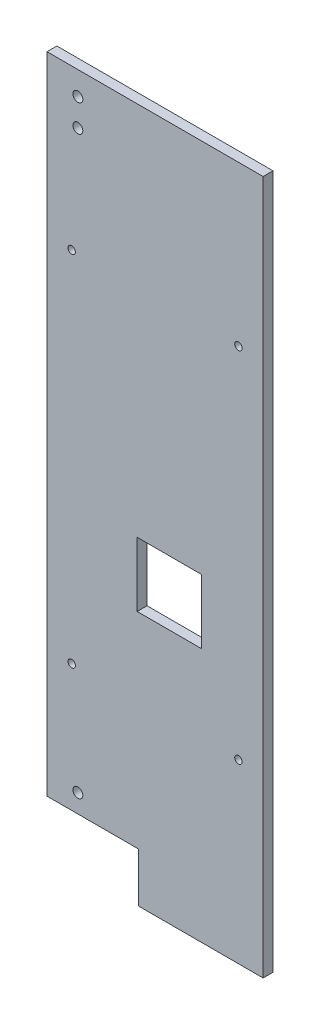
ISO-10303-21;
HEADER;
FILE_DESCRIPTION(('STEP AP214'),'2;1');
FILE_NAME('part.step','',(''),(''),'','','');
FILE_SCHEMA(('AUTOMOTIVE_DESIGN { 1 0 10303 214 1 1 1 1 }'));
ENDSEC;
DATA;
#1=APPLICATION_CONTEXT('core data for automotive mechanical design processes');
#2=APPLICATION_PROTOCOL_DEFINITION('international standard','automotive_design',2000,#1);
#3=PRODUCT_CONTEXT('',#1,'mechanical');
#4=PRODUCT('Part','Part','',(#3));
#5=PRODUCT_RELATED_PRODUCT_CATEGORY('part','',(#4));
#6=PRODUCT_DEFINITION_FORMATION('','',#4);
#7=PRODUCT_DEFINITION_CONTEXT('part definition',#1,'design');
#8=PRODUCT_DEFINITION('design','',#6,#7);
#9=PRODUCT_DEFINITION_SHAPE('','',#8);
#10=(LENGTH_UNIT() NAMED_UNIT(*) SI_UNIT(.MILLI.,.METRE.));
#11=(NAMED_UNIT(*) PLANE_ANGLE_UNIT() SI_UNIT($,.RADIAN.));
#12=(NAMED_UNIT(*) SI_UNIT($,.STERADIAN.) SOLID_ANGLE_UNIT());
#13=UNCERTAINTY_MEASURE_WITH_UNIT(LENGTH_MEASURE(1.E-05),#10,'distance_accuracy_value','');
#14=(GEOMETRIC_REPRESENTATION_CONTEXT(3) GLOBAL_UNCERTAINTY_ASSIGNED_CONTEXT((#13)) GLOBAL_UNIT_ASSIGNED_CONTEXT((#10,
#11,#12)) REPRESENTATION_CONTEXT('',''));
#15=CARTESIAN_POINT('',(0.,0.,0.));
#16=DIRECTION('',(0.,0.,1.));
#17=DIRECTION('',(1.,0.,0.));
#18=AXIS2_PLACEMENT_3D('',#15,#16,#17);
#19=CARTESIAN_POINT('',(-30.5376862476674,-226.819578947368,4.));
#20=DIRECTION('',(0.,0.,1.));
#21=DIRECTION('',(1.,0.,0.));
#22=AXIS2_PLACEMENT_3D('',#19,#20,#21);
#23=PLANE('',#22);
#24=CARTESIAN_POINT('',(-18.0376862476674,24.6804210526316,4.));
#25=DIRECTION('',(0.,0.,1.));
#26=DIRECTION('',(1.,0.,0.));
#27=AXIS2_PLACEMENT_3D('',#24,#25,#26);
#28=CIRCLE('',#27,2.);
#29=CARTESIAN_POINT('',(-16.0376862476674,24.6804210526316,4.));
#30=VERTEX_POINT('',#29);
#31=EDGE_CURVE('E284',#30,#30,#28,.T.);
#32=ORIENTED_EDGE('',*,*,#31,.F.);
#33=EDGE_LOOP('',(#32));
#34=FACE_BOUND('',#33,.T.);
#35=CARTESIAN_POINT('',(46.9623137523326,-175.319578947368,4.));
#36=DIRECTION('',(0.,0.,1.));
#37=DIRECTION('',(1.,0.,0.));
#38=AXIS2_PLACEMENT_3D('',#35,#36,#37);
#39=CIRCLE('',#38,1.5);
#40=CARTESIAN_POINT('',(48.4623137523326,-175.319578947368,4.));
#41=VERTEX_POINT('',#40);
#42=EDGE_CURVE('E296',#41,#41,#39,.T.);
#43=ORIENTED_EDGE('',*,*,#42,.F.);
#44=EDGE_LOOP('',(#43));
#45=FACE_BOUND('',#44,.T.);
#46=CARTESIAN_POINT('',(-20.5376862476674,-30.3195789473684,4.));
#47=DIRECTION('',(0.,0.,1.));
#48=DIRECTION('',(1.,0.,0.));
#49=AXIS2_PLACEMENT_3D('',#46,#47,#48);
#50=CIRCLE('',#49,1.5);
#51=CARTESIAN_POINT('',(-19.0376862476674,-30.3195789473684,4.));
#52=VERTEX_POINT('',#51);
#53=EDGE_CURVE('E308',#52,#52,#50,.T.);
#54=ORIENTED_EDGE('',*,*,#53,.F.);
#55=EDGE_LOOP('',(#54));
#56=FACE_BOUND('',#55,.T.);
#57=DIRECTION('',(1.,0.,0.));
#58=VECTOR('',#57,1.);
#59=CARTESIAN_POINT('',(5.96231375233261,-143.819578947368,4.));
#60=LINE('',#59,#58);
#61=CARTESIAN_POINT('',(5.96231375233261,-143.819578947368,4.));
#62=VERTEX_POINT('',#61);
#63=CARTESIAN_POINT('',(31.9623137523326,-143.819578947368,4.));
#64=VERTEX_POINT('',#63);
#65=EDGE_CURVE('E116',#62,#64,#60,.T.);
#66=ORIENTED_EDGE('',*,*,#65,.F.);
#67=DIRECTION('',(0.,-1.,0.));
#68=VECTOR('',#67,1.);
#69=CARTESIAN_POINT('',(5.9623137523326,-117.819578947368,4.));
#70=LINE('',#69,#68);
#71=CARTESIAN_POINT('',(5.9623137523326,-117.819578947368,4.));
#72=VERTEX_POINT('',#71);
#73=EDGE_CURVE('E108',#72,#62,#70,.T.);
#74=ORIENTED_EDGE('',*,*,#73,.F.);
#75=DIRECTION('',(-1.,0.,0.));
#76=VECTOR('',#75,1.);
#77=CARTESIAN_POINT('',(5.9623137523326,-117.819578947368,4.));
#78=LINE('',#77,#76);
#79=CARTESIAN_POINT('',(31.9623137523326,-117.819578947368,4.));
#80=VERTEX_POINT('',#79);
#81=EDGE_CURVE('E131',#80,#72,#78,.T.);
#82=ORIENTED_EDGE('',*,*,#81,.F.);
#83=DIRECTION('',(0.,1.,0.));
#84=VECTOR('',#83,1.);
#85=CARTESIAN_POINT('',(31.9623137523326,-117.819578947368,4.));
#86=LINE('',#85,#84);
#87=EDGE_CURVE('E129',#64,#80,#86,.T.);
#88=ORIENTED_EDGE('',*,*,#87,.F.);
#89=EDGE_LOOP('',(#66,#74,#82,#88));
#90=FACE_BOUND('',#89,.T.);
#91=DIRECTION('',(0.,-1.,0.));
#92=VECTOR('',#91,1.);
#93=CARTESIAN_POINT('',(-30.5376862476674,34.1804210526316,4.));
#94=LINE('',#93,#92);
#95=CARTESIAN_POINT('',(-30.5376862476674,34.1804210526316,4.));
#96=VERTEX_POINT('',#95);
#97=CARTESIAN_POINT('',(-30.5376862476674,-226.819578947368,4.));
#98=VERTEX_POINT('',#97);
#99=EDGE_CURVE('E147',#96,#98,#94,.T.);
#100=ORIENTED_EDGE('',*,*,#99,.T.);
#101=DIRECTION('',(1.,0.,0.));
#102=VECTOR('',#101,1.);
#103=CARTESIAN_POINT('',(-30.5376862476674,-226.819578947368,4.));
#104=LINE('',#103,#102);
#105=CARTESIAN_POINT('',(6.46231375233264,-226.819578947368,4.));
#106=VERTEX_POINT('',#105);
#107=EDGE_CURVE('E150',#98,#106,#104,.T.);
#108=ORIENTED_EDGE('',*,*,#107,.T.);
#109=DIRECTION('',(0.,-1.,0.));
#110=VECTOR('',#109,1.);
#111=CARTESIAN_POINT('',(6.46231375233264,-246.819578947368,4.));
#112=LINE('',#111,#110);
#113=CARTESIAN_POINT('',(6.46231375233264,-246.819578947368,4.));
#114=VERTEX_POINT('',#113);
#115=EDGE_CURVE('E153',#106,#114,#112,.T.);
#116=ORIENTED_EDGE('',*,*,#115,.T.);
#117=DIRECTION('',(1.,0.,0.));
#118=VECTOR('',#117,1.);
#119=CARTESIAN_POINT('',(6.46231375233264,-246.819578947368,4.));
#120=LINE('',#119,#118);
#121=CARTESIAN_POINT('',(56.9623137523326,-246.819578947368,4.));
#122=VERTEX_POINT('',#121);
#123=EDGE_CURVE('E155',#114,#122,#120,.T.);
#124=ORIENTED_EDGE('',*,*,#123,.T.);
#125=DIRECTION('',(0.,1.,0.));
#126=VECTOR('',#125,1.);
#127=CARTESIAN_POINT('',(56.9623137523326,34.1804210526316,4.));
#128=LINE('',#127,#126);
#129=CARTESIAN_POINT('',(56.9623137523326,34.1804210526316,4.));
#130=VERTEX_POINT('',#129);
#131=EDGE_CURVE('E157',#122,#130,#128,.T.);
#132=ORIENTED_EDGE('',*,*,#131,.T.);
#133=DIRECTION('',(-1.,0.,0.));
#134=VECTOR('',#133,1.);
#135=CARTESIAN_POINT('',(-30.5376862476674,34.1804210526316,4.));
#136=LINE('',#135,#134);
#137=EDGE_CURVE('E159',#130,#96,#136,.T.);
#138=ORIENTED_EDGE('',*,*,#137,.T.);
#139=EDGE_LOOP('',(#100,#108,#116,#124,#132,#138));
#140=FACE_BOUND('',#139,.T.);
#141=CARTESIAN_POINT('',(-20.5376862476674,-175.319578947368,4.));
#142=DIRECTION('',(0.,0.,1.));
#143=DIRECTION('',(1.,0.,0.));
#144=AXIS2_PLACEMENT_3D('',#141,#142,#143);
#145=CIRCLE('',#144,1.5);
#146=CARTESIAN_POINT('',(-19.0376862476674,-175.319578947368,4.));
#147=VERTEX_POINT('',#146);
#148=EDGE_CURVE('E137',#147,#147,#145,.T.);
#149=ORIENTED_EDGE('',*,*,#148,.F.);
#150=EDGE_LOOP('',(#149));
#151=FACE_BOUND('',#150,.T.);
#152=CARTESIAN_POINT('',(46.9623137523326,-30.3195789473684,4.));
#153=DIRECTION('',(0.,0.,1.));
#154=DIRECTION('',(1.,0.,0.));
#155=AXIS2_PLACEMENT_3D('',#152,#153,#154);
#156=CIRCLE('',#155,1.5);
#157=CARTESIAN_POINT('',(48.4623137523326,-30.3195789473684,4.));
#158=VERTEX_POINT('',#157);
#159=EDGE_CURVE('E302',#158,#158,#156,.T.);
#160=ORIENTED_EDGE('',*,*,#159,.F.);
#161=EDGE_LOOP('',(#160));
#162=FACE_BOUND('',#161,.T.);
#163=CARTESIAN_POINT('',(-18.0376862476673,-219.319578947368,4.));
#164=DIRECTION('',(0.,0.,1.));
#165=DIRECTION('',(1.,0.,0.));
#166=AXIS2_PLACEMENT_3D('',#163,#164,#165);
#167=CIRCLE('',#166,2.00000000000001);
#168=CARTESIAN_POINT('',(-16.0376862476673,-219.319578947368,4.));
#169=VERTEX_POINT('',#168);
#170=EDGE_CURVE('E290',#169,#169,#167,.T.);
#171=ORIENTED_EDGE('',*,*,#170,.F.);
#172=EDGE_LOOP('',(#171));
#173=FACE_BOUND('',#172,.T.);
#174=CARTESIAN_POINT('',(-18.0376862476674,13.6804210526316,4.));
#175=DIRECTION('',(0.,0.,1.));
#176=DIRECTION('',(1.,0.,0.));
#177=AXIS2_PLACEMENT_3D('',#174,#175,#176);
#178=CIRCLE('',#177,2.);
#179=CARTESIAN_POINT('',(-16.0376862476674,13.6804210526316,4.));
#180=VERTEX_POINT('',#179);
#181=EDGE_CURVE('E275',#180,#180,#178,.T.);
#182=ORIENTED_EDGE('',*,*,#181,.F.);
#183=EDGE_LOOP('',(#182));
#184=FACE_BOUND('',#183,.T.);
#185=ADVANCED_FACE('F31',(#34,#45,#56,#90,#140,#151,#162,#173,#184),#23,.T.);
#186=CARTESIAN_POINT('',(-30.5376862476674,-226.819578947368,0.));
#187=DIRECTION('',(0.,0.,1.));
#188=DIRECTION('',(1.,0.,0.));
#189=AXIS2_PLACEMENT_3D('',#186,#187,#188);
#190=PLANE('',#189);
#191=CARTESIAN_POINT('',(-18.0376862476674,24.6804210526316,0.));
#192=DIRECTION('',(0.,0.,1.));
#193=DIRECTION('',(1.,0.,0.));
#194=AXIS2_PLACEMENT_3D('',#191,#192,#193);
#195=CIRCLE('',#194,2.);
#196=CARTESIAN_POINT('',(-16.0376862476674,24.6804210526316,0.));
#197=VERTEX_POINT('',#196);
#198=EDGE_CURVE('E281',#197,#197,#195,.T.);
#199=ORIENTED_EDGE('',*,*,#198,.T.);
#200=EDGE_LOOP('',(#199));
#201=FACE_BOUND('',#200,.T.);
#202=CARTESIAN_POINT('',(46.9623137523326,-175.319578947368,0.));
#203=DIRECTION('',(0.,0.,1.));
#204=DIRECTION('',(1.,0.,0.));
#205=AXIS2_PLACEMENT_3D('',#202,#203,#204);
#206=CIRCLE('',#205,1.5);
#207=CARTESIAN_POINT('',(48.4623137523326,-175.319578947368,0.));
#208=VERTEX_POINT('',#207);
#209=EDGE_CURVE('E293',#208,#208,#206,.T.);
#210=ORIENTED_EDGE('',*,*,#209,.T.);
#211=EDGE_LOOP('',(#210));
#212=FACE_BOUND('',#211,.T.);
#213=CARTESIAN_POINT('',(-20.5376862476674,-30.3195789473684,0.));
#214=DIRECTION('',(0.,0.,1.));
#215=DIRECTION('',(1.,0.,0.));
#216=AXIS2_PLACEMENT_3D('',#213,#214,#215);
#217=CIRCLE('',#216,1.5);
#218=CARTESIAN_POINT('',(-19.0376862476674,-30.3195789473684,0.));
#219=VERTEX_POINT('',#218);
#220=EDGE_CURVE('E305',#219,#219,#217,.T.);
#221=ORIENTED_EDGE('',*,*,#220,.T.);
#222=EDGE_LOOP('',(#221));
#223=FACE_BOUND('',#222,.T.);
#224=DIRECTION('',(0.,-1.,0.));
#225=VECTOR('',#224,1.);
#226=CARTESIAN_POINT('',(5.9623137523326,-117.819578947368,0.));
#227=LINE('',#226,#225);
#228=CARTESIAN_POINT('',(5.96231375233261,-117.819578947368,0.));
#229=VERTEX_POINT('',#228);
#230=CARTESIAN_POINT('',(5.96231375233261,-143.819578947368,0.));
#231=VERTEX_POINT('',#230);
#232=EDGE_CURVE('E54',#229,#231,#227,.T.);
#233=ORIENTED_EDGE('',*,*,#232,.T.);
#234=DIRECTION('',(1.,0.,0.));
#235=VECTOR('',#234,1.);
#236=CARTESIAN_POINT('',(5.96231375233261,-143.819578947368,0.));
#237=LINE('',#236,#235);
#238=CARTESIAN_POINT('',(31.9623137523326,-143.819578947368,0.));
#239=VERTEX_POINT('',#238);
#240=EDGE_CURVE('E123',#231,#239,#237,.T.);
#241=ORIENTED_EDGE('',*,*,#240,.T.);
#242=DIRECTION('',(0.,1.,0.));
#243=VECTOR('',#242,1.);
#244=CARTESIAN_POINT('',(31.9623137523326,-117.819578947368,0.));
#245=LINE('',#244,#243);
#246=CARTESIAN_POINT('',(31.9623137523326,-117.819578947368,0.));
#247=VERTEX_POINT('',#246);
#248=EDGE_CURVE('E139',#239,#247,#245,.T.);
#249=ORIENTED_EDGE('',*,*,#248,.T.);
#250=DIRECTION('',(-1.,0.,0.));
#251=VECTOR('',#250,1.);
#252=CARTESIAN_POINT('',(5.9623137523326,-117.819578947368,0.));
#253=LINE('',#252,#251);
#254=EDGE_CURVE('E117',#247,#229,#253,.T.);
#255=ORIENTED_EDGE('',*,*,#254,.T.);
#256=EDGE_LOOP('',(#233,#241,#249,#255));
#257=FACE_BOUND('',#256,.T.);
#258=DIRECTION('',(0.,-1.,0.));
#259=VECTOR('',#258,1.);
#260=CARTESIAN_POINT('',(-30.5376862476674,34.1804210526316,0.));
#261=LINE('',#260,#259);
#262=CARTESIAN_POINT('',(-30.5376862476674,34.1804210526316,0.));
#263=VERTEX_POINT('',#262);
#264=CARTESIAN_POINT('',(-30.5376862476674,-226.819578947368,0.));
#265=VERTEX_POINT('',#264);
#266=EDGE_CURVE('E124',#263,#265,#261,.T.);
#267=ORIENTED_EDGE('',*,*,#266,.F.);
#268=DIRECTION('',(-1.,0.,0.));
#269=VECTOR('',#268,1.);
#270=CARTESIAN_POINT('',(-30.5376862476674,34.1804210526316,0.));
#271=LINE('',#270,#269);
#272=CARTESIAN_POINT('',(56.9623137523326,34.1804210526316,0.));
#273=VERTEX_POINT('',#272);
#274=EDGE_CURVE('E151',#273,#263,#271,.T.);
#275=ORIENTED_EDGE('',*,*,#274,.F.);
#276=DIRECTION('',(0.,1.,0.));
#277=VECTOR('',#276,1.);
#278=CARTESIAN_POINT('',(56.9623137523326,34.1804210526316,0.));
#279=LINE('',#278,#277);
#280=CARTESIAN_POINT('',(56.9623137523326,-246.819578947368,0.));
#281=VERTEX_POINT('',#280);
#282=EDGE_CURVE('E170',#281,#273,#279,.T.);
#283=ORIENTED_EDGE('',*,*,#282,.F.);
#284=DIRECTION('',(1.,0.,0.));
#285=VECTOR('',#284,1.);
#286=CARTESIAN_POINT('',(6.46231375233264,-246.819578947368,0.));
#287=LINE('',#286,#285);
#288=CARTESIAN_POINT('',(6.46231375233264,-246.819578947368,0.));
#289=VERTEX_POINT('',#288);
#290=EDGE_CURVE('E168',#289,#281,#287,.T.);
#291=ORIENTED_EDGE('',*,*,#290,.F.);
#292=DIRECTION('',(0.,-1.,0.));
#293=VECTOR('',#292,1.);
#294=CARTESIAN_POINT('',(6.46231375233264,-246.819578947368,0.));
#295=LINE('',#294,#293);
#296=CARTESIAN_POINT('',(6.46231375233264,-226.819578947368,0.));
#297=VERTEX_POINT('',#296);
#298=EDGE_CURVE('E166',#297,#289,#295,.T.);
#299=ORIENTED_EDGE('',*,*,#298,.F.);
#300=DIRECTION('',(1.,0.,0.));
#301=VECTOR('',#300,1.);
#302=CARTESIAN_POINT('',(-30.5376862476674,-226.819578947368,0.));
#303=LINE('',#302,#301);
#304=EDGE_CURVE('E164',#265,#297,#303,.T.);
#305=ORIENTED_EDGE('',*,*,#304,.F.);
#306=EDGE_LOOP('',(#267,#275,#283,#291,#299,#305));
#307=FACE_BOUND('',#306,.T.);
#308=CARTESIAN_POINT('',(-20.5376862476674,-175.319578947368,0.));
#309=DIRECTION('',(0.,0.,1.));
#310=DIRECTION('',(1.,0.,0.));
#311=AXIS2_PLACEMENT_3D('',#308,#309,#310);
#312=CIRCLE('',#311,1.5);
#313=CARTESIAN_POINT('',(-19.0376862476674,-175.319578947368,0.));
#314=VERTEX_POINT('',#313);
#315=EDGE_CURVE('E311',#314,#314,#312,.T.);
#316=ORIENTED_EDGE('',*,*,#315,.T.);
#317=EDGE_LOOP('',(#316));
#318=FACE_BOUND('',#317,.T.);
#319=CARTESIAN_POINT('',(46.9623137523326,-30.3195789473684,0.));
#320=DIRECTION('',(0.,0.,1.));
#321=DIRECTION('',(1.,0.,0.));
#322=AXIS2_PLACEMENT_3D('',#319,#320,#321);
#323=CIRCLE('',#322,1.5);
#324=CARTESIAN_POINT('',(48.4623137523326,-30.3195789473684,0.));
#325=VERTEX_POINT('',#324);
#326=EDGE_CURVE('E299',#325,#325,#323,.T.);
#327=ORIENTED_EDGE('',*,*,#326,.T.);
#328=EDGE_LOOP('',(#327));
#329=FACE_BOUND('',#328,.T.);
#330=CARTESIAN_POINT('',(-18.0376862476673,-219.319578947368,0.));
#331=DIRECTION('',(0.,0.,1.));
#332=DIRECTION('',(1.,0.,0.));
#333=AXIS2_PLACEMENT_3D('',#330,#331,#332);
#334=CIRCLE('',#333,2.00000000000001);
#335=CARTESIAN_POINT('',(-16.0376862476673,-219.319578947368,0.));
#336=VERTEX_POINT('',#335);
#337=EDGE_CURVE('E287',#336,#336,#334,.T.);
#338=ORIENTED_EDGE('',*,*,#337,.T.);
#339=EDGE_LOOP('',(#338));
#340=FACE_BOUND('',#339,.T.);
#341=CARTESIAN_POINT('',(-18.0376862476674,13.6804210526316,0.));
#342=DIRECTION('',(0.,0.,1.));
#343=DIRECTION('',(1.,0.,0.));
#344=AXIS2_PLACEMENT_3D('',#341,#342,#343);
#345=CIRCLE('',#344,2.);
#346=CARTESIAN_POINT('',(-16.0376862476674,13.6804210526316,0.));
#347=VERTEX_POINT('',#346);
#348=EDGE_CURVE('E278',#347,#347,#345,.T.);
#349=ORIENTED_EDGE('',*,*,#348,.T.);
#350=EDGE_LOOP('',(#349));
#351=FACE_BOUND('',#350,.T.);
#352=ADVANCED_FACE('F194',(#201,#212,#223,#257,#307,#318,#329,#340,#351),#190,.F.);
#353=CARTESIAN_POINT('',(-30.5376862476674,34.1804210526316,4.));
#354=DIRECTION('',(1.,0.,0.));
#355=DIRECTION('',(0.,1.,0.));
#356=AXIS2_PLACEMENT_3D('',#353,#354,#355);
#357=PLANE('',#356);
#358=ORIENTED_EDGE('',*,*,#266,.T.);
#359=DIRECTION('',(0.,0.,-1.));
#360=VECTOR('',#359,1.);
#361=CARTESIAN_POINT('',(-30.5376862476674,-226.819578947368,4.));
#362=LINE('',#361,#360);
#363=EDGE_CURVE('E11',#98,#265,#362,.T.);
#364=ORIENTED_EDGE('',*,*,#363,.F.);
#365=ORIENTED_EDGE('',*,*,#99,.F.);
#366=DIRECTION('',(0.,0.,-1.));
#367=VECTOR('',#366,1.);
#368=CARTESIAN_POINT('',(-30.5376862476674,34.1804210526316,4.));
#369=LINE('',#368,#367);
#370=EDGE_CURVE('E161',#96,#263,#369,.T.);
#371=ORIENTED_EDGE('',*,*,#370,.T.);
#372=EDGE_LOOP('',(#358,#364,#365,#371));
#373=FACE_BOUND('',#372,.T.);
#374=ADVANCED_FACE('F33',(#373),#357,.F.);
#375=CARTESIAN_POINT('',(-30.5376862476674,-226.819578947368,4.));
#376=DIRECTION('',(0.,1.,0.));
#377=DIRECTION('',(0.,0.,1.));
#378=AXIS2_PLACEMENT_3D('',#375,#376,#377);
#379=PLANE('',#378);
#380=ORIENTED_EDGE('',*,*,#304,.T.);
#381=DIRECTION('',(0.,0.,-1.));
#382=VECTOR('',#381,1.);
#383=CARTESIAN_POINT('',(6.46231375233264,-226.819578947368,4.));
#384=LINE('',#383,#382);
#385=EDGE_CURVE('E39',#106,#297,#384,.T.);
#386=ORIENTED_EDGE('',*,*,#385,.F.);
#387=ORIENTED_EDGE('',*,*,#107,.F.);
#388=ORIENTED_EDGE('',*,*,#363,.T.);
#389=EDGE_LOOP('',(#380,#386,#387,#388));
#390=FACE_BOUND('',#389,.T.);
#391=ADVANCED_FACE('F211',(#390),#379,.F.);
#392=CARTESIAN_POINT('',(6.46231375233264,-246.819578947368,4.));
#393=DIRECTION('',(1.,0.,0.));
#394=DIRECTION('',(0.,0.,-1.));
#395=AXIS2_PLACEMENT_3D('',#392,#393,#394);
#396=PLANE('',#395);
#397=ORIENTED_EDGE('',*,*,#298,.T.);
#398=DIRECTION('',(0.,0.,-1.));
#399=VECTOR('',#398,1.);
#400=CARTESIAN_POINT('',(6.46231375233264,-246.819578947368,4.));
#401=LINE('',#400,#399);
#402=EDGE_CURVE('E181',#114,#289,#401,.T.);
#403=ORIENTED_EDGE('',*,*,#402,.F.);
#404=ORIENTED_EDGE('',*,*,#115,.F.);
#405=ORIENTED_EDGE('',*,*,#385,.T.);
#406=EDGE_LOOP('',(#397,#403,#404,#405));
#407=FACE_BOUND('',#406,.T.);
#408=ADVANCED_FACE('F188',(#407),#396,.F.);
#409=CARTESIAN_POINT('',(6.46231375233264,-246.819578947368,4.));
#410=DIRECTION('',(0.,1.,0.));
#411=DIRECTION('',(0.,0.,1.));
#412=AXIS2_PLACEMENT_3D('',#409,#410,#411);
#413=PLANE('',#412);
#414=ORIENTED_EDGE('',*,*,#290,.T.);
#415=DIRECTION('',(0.,0.,-1.));
#416=VECTOR('',#415,1.);
#417=CARTESIAN_POINT('',(56.9623137523326,-246.819578947368,4.));
#418=LINE('',#417,#416);
#419=EDGE_CURVE('E178',#122,#281,#418,.T.);
#420=ORIENTED_EDGE('',*,*,#419,.F.);
#421=ORIENTED_EDGE('',*,*,#123,.F.);
#422=ORIENTED_EDGE('',*,*,#402,.T.);
#423=EDGE_LOOP('',(#414,#420,#421,#422));
#424=FACE_BOUND('',#423,.T.);
#425=ADVANCED_FACE('F200',(#424),#413,.F.);
#426=CARTESIAN_POINT('',(56.9623137523326,34.1804210526316,4.));
#427=DIRECTION('',(-1.,0.,0.));
#428=DIRECTION('',(0.,-1.,0.));
#429=AXIS2_PLACEMENT_3D('',#426,#427,#428);
#430=PLANE('',#429);
#431=ORIENTED_EDGE('',*,*,#282,.T.);
#432=DIRECTION('',(0.,0.,-1.));
#433=VECTOR('',#432,1.);
#434=CARTESIAN_POINT('',(56.9623137523326,34.1804210526316,4.));
#435=LINE('',#434,#433);
#436=EDGE_CURVE('E175',#130,#273,#435,.T.);
#437=ORIENTED_EDGE('',*,*,#436,.F.);
#438=ORIENTED_EDGE('',*,*,#131,.F.);
#439=ORIENTED_EDGE('',*,*,#419,.T.);
#440=EDGE_LOOP('',(#431,#437,#438,#439));
#441=FACE_BOUND('',#440,.T.);
#442=ADVANCED_FACE('F204',(#441),#430,.F.);
#443=CARTESIAN_POINT('',(-30.5376862476674,34.1804210526316,4.));
#444=DIRECTION('',(0.,-1.,0.));
#445=DIRECTION('',(0.,0.,-1.));
#446=AXIS2_PLACEMENT_3D('',#443,#444,#445);
#447=PLANE('',#446);
#448=ORIENTED_EDGE('',*,*,#274,.T.);
#449=ORIENTED_EDGE('',*,*,#370,.F.);
#450=ORIENTED_EDGE('',*,*,#137,.F.);
#451=ORIENTED_EDGE('',*,*,#436,.T.);
#452=EDGE_LOOP('',(#448,#449,#450,#451));
#453=FACE_BOUND('',#452,.T.);
#454=ADVANCED_FACE('F214',(#453),#447,.F.);
#455=CARTESIAN_POINT('',(5.9623137523326,-117.819578947368,4.));
#456=DIRECTION('',(1.,0.,0.));
#457=DIRECTION('',(0.,1.,0.));
#458=AXIS2_PLACEMENT_3D('',#455,#456,#457);
#459=PLANE('',#458);
#460=ORIENTED_EDGE('',*,*,#232,.F.);
#461=DIRECTION('',(0.,0.,-1.));
#462=VECTOR('',#461,1.);
#463=CARTESIAN_POINT('',(5.9623137523326,-117.819578947368,4.));
#464=LINE('',#463,#462);
#465=EDGE_CURVE('E112',#72,#229,#464,.T.);
#466=ORIENTED_EDGE('',*,*,#465,.F.);
#467=ORIENTED_EDGE('',*,*,#73,.T.);
#468=DIRECTION('',(0.,0.,-1.));
#469=VECTOR('',#468,1.);
#470=CARTESIAN_POINT('',(5.96231375233261,-143.819578947368,4.));
#471=LINE('',#470,#469);
#472=EDGE_CURVE('E111',#62,#231,#471,.T.);
#473=ORIENTED_EDGE('',*,*,#472,.T.);
#474=EDGE_LOOP('',(#460,#466,#467,#473));
#475=FACE_BOUND('',#474,.T.);
#476=ADVANCED_FACE('F110',(#475),#459,.T.);
#477=CARTESIAN_POINT('',(5.96231375233261,-143.819578947368,4.));
#478=DIRECTION('',(0.,1.,0.));
#479=DIRECTION('',(0.,0.,1.));
#480=AXIS2_PLACEMENT_3D('',#477,#478,#479);
#481=PLANE('',#480);
#482=ORIENTED_EDGE('',*,*,#240,.F.);
#483=ORIENTED_EDGE('',*,*,#472,.F.);
#484=ORIENTED_EDGE('',*,*,#65,.T.);
#485=DIRECTION('',(0.,0.,-1.));
#486=VECTOR('',#485,1.);
#487=CARTESIAN_POINT('',(31.9623137523326,-143.819578947368,4.));
#488=LINE('',#487,#486);
#489=EDGE_CURVE('E125',#64,#239,#488,.T.);
#490=ORIENTED_EDGE('',*,*,#489,.T.);
#491=EDGE_LOOP('',(#482,#483,#484,#490));
#492=FACE_BOUND('',#491,.T.);
#493=ADVANCED_FACE('F120',(#492),#481,.T.);
#494=CARTESIAN_POINT('',(31.9623137523326,-117.819578947368,4.));
#495=DIRECTION('',(-1.,0.,0.));
#496=DIRECTION('',(0.,0.,1.));
#497=AXIS2_PLACEMENT_3D('',#494,#495,#496);
#498=PLANE('',#497);
#499=ORIENTED_EDGE('',*,*,#248,.F.);
#500=ORIENTED_EDGE('',*,*,#489,.F.);
#501=ORIENTED_EDGE('',*,*,#87,.T.);
#502=DIRECTION('',(0.,0.,-1.));
#503=VECTOR('',#502,1.);
#504=CARTESIAN_POINT('',(31.9623137523326,-117.819578947368,4.));
#505=LINE('',#504,#503);
#506=EDGE_CURVE('E46',#80,#247,#505,.T.);
#507=ORIENTED_EDGE('',*,*,#506,.T.);
#508=EDGE_LOOP('',(#499,#500,#501,#507));
#509=FACE_BOUND('',#508,.T.);
#510=ADVANCED_FACE('F236',(#509),#498,.T.);
#511=CARTESIAN_POINT('',(5.9623137523326,-117.819578947368,4.));
#512=DIRECTION('',(0.,-1.,0.));
#513=DIRECTION('',(1.,0.,0.));
#514=AXIS2_PLACEMENT_3D('',#511,#512,#513);
#515=PLANE('',#514);
#516=ORIENTED_EDGE('',*,*,#254,.F.);
#517=ORIENTED_EDGE('',*,*,#506,.F.);
#518=ORIENTED_EDGE('',*,*,#81,.T.);
#519=ORIENTED_EDGE('',*,*,#465,.T.);
#520=EDGE_LOOP('',(#516,#517,#518,#519));
#521=FACE_BOUND('',#520,.T.);
#522=ADVANCED_FACE('F239',(#521),#515,.T.);
#523=CARTESIAN_POINT('',(-20.5376862476674,-175.319578947368,4.));
#524=DIRECTION('',(0.,0.,-1.));
#525=DIRECTION('',(-1.,0.,0.));
#526=AXIS2_PLACEMENT_3D('',#523,#524,#525);
#527=CYLINDRICAL_SURFACE('',#526,1.5);
#528=ORIENTED_EDGE('',*,*,#148,.T.);
#529=EDGE_LOOP('',(#528));
#530=FACE_BOUND('',#529,.T.);
#531=ORIENTED_EDGE('',*,*,#315,.F.);
#532=EDGE_LOOP('',(#531));
#533=FACE_BOUND('',#532,.T.);
#534=ADVANCED_FACE('F243',(#530,#533),#527,.F.);
#535=CARTESIAN_POINT('',(-20.5376862476674,-30.3195789473684,4.));
#536=DIRECTION('',(0.,0.,-1.));
#537=DIRECTION('',(-1.,0.,0.));
#538=AXIS2_PLACEMENT_3D('',#535,#536,#537);
#539=CYLINDRICAL_SURFACE('',#538,1.5);
#540=ORIENTED_EDGE('',*,*,#53,.T.);
#541=EDGE_LOOP('',(#540));
#542=FACE_BOUND('',#541,.T.);
#543=ORIENTED_EDGE('',*,*,#220,.F.);
#544=EDGE_LOOP('',(#543));
#545=FACE_BOUND('',#544,.T.);
#546=ADVANCED_FACE('F246',(#542,#545),#539,.F.);
#547=CARTESIAN_POINT('',(46.9623137523326,-30.3195789473684,4.));
#548=DIRECTION('',(0.,0.,-1.));
#549=DIRECTION('',(-1.,0.,0.));
#550=AXIS2_PLACEMENT_3D('',#547,#548,#549);
#551=CYLINDRICAL_SURFACE('',#550,1.5);
#552=ORIENTED_EDGE('',*,*,#159,.T.);
#553=EDGE_LOOP('',(#552));
#554=FACE_BOUND('',#553,.T.);
#555=ORIENTED_EDGE('',*,*,#326,.F.);
#556=EDGE_LOOP('',(#555));
#557=FACE_BOUND('',#556,.T.);
#558=ADVANCED_FACE('F250',(#554,#557),#551,.F.);
#559=CARTESIAN_POINT('',(46.9623137523326,-175.319578947368,4.));
#560=DIRECTION('',(0.,0.,-1.));
#561=DIRECTION('',(-1.,0.,0.));
#562=AXIS2_PLACEMENT_3D('',#559,#560,#561);
#563=CYLINDRICAL_SURFACE('',#562,1.5);
#564=ORIENTED_EDGE('',*,*,#42,.T.);
#565=EDGE_LOOP('',(#564));
#566=FACE_BOUND('',#565,.T.);
#567=ORIENTED_EDGE('',*,*,#209,.F.);
#568=EDGE_LOOP('',(#567));
#569=FACE_BOUND('',#568,.T.);
#570=ADVANCED_FACE('F254',(#566,#569),#563,.F.);
#571=CARTESIAN_POINT('',(-18.0376862476673,-219.319578947368,4.));
#572=DIRECTION('',(0.,0.,-1.));
#573=DIRECTION('',(-1.,0.,0.));
#574=AXIS2_PLACEMENT_3D('',#571,#572,#573);
#575=CYLINDRICAL_SURFACE('',#574,2.00000000000001);
#576=ORIENTED_EDGE('',*,*,#170,.T.);
#577=EDGE_LOOP('',(#576));
#578=FACE_BOUND('',#577,.T.);
#579=ORIENTED_EDGE('',*,*,#337,.F.);
#580=EDGE_LOOP('',(#579));
#581=FACE_BOUND('',#580,.T.);
#582=ADVANCED_FACE('F258',(#578,#581),#575,.F.);
#583=CARTESIAN_POINT('',(-18.0376862476674,24.6804210526316,4.));
#584=DIRECTION('',(0.,0.,-1.));
#585=DIRECTION('',(-1.,0.,0.));
#586=AXIS2_PLACEMENT_3D('',#583,#584,#585);
#587=CYLINDRICAL_SURFACE('',#586,2.);
#588=ORIENTED_EDGE('',*,*,#31,.T.);
#589=EDGE_LOOP('',(#588));
#590=FACE_BOUND('',#589,.T.);
#591=ORIENTED_EDGE('',*,*,#198,.F.);
#592=EDGE_LOOP('',(#591));
#593=FACE_BOUND('',#592,.T.);
#594=ADVANCED_FACE('F262',(#590,#593),#587,.F.);
#595=CARTESIAN_POINT('',(-18.0376862476674,13.6804210526316,4.));
#596=DIRECTION('',(0.,0.,-1.));
#597=DIRECTION('',(-1.,0.,0.));
#598=AXIS2_PLACEMENT_3D('',#595,#596,#597);
#599=CYLINDRICAL_SURFACE('',#598,2.);
#600=ORIENTED_EDGE('',*,*,#181,.T.);
#601=EDGE_LOOP('',(#600));
#602=FACE_BOUND('',#601,.T.);
#603=ORIENTED_EDGE('',*,*,#348,.F.);
#604=EDGE_LOOP('',(#603));
#605=FACE_BOUND('',#604,.T.);
#606=ADVANCED_FACE('F266',(#602,#605),#599,.F.);
#607=CLOSED_SHELL('',(#185,#352,#374,#391,#408,#425,#442,#454,#476,#493,#510,#522,#534,#546,
#558,#570,#582,#594,#606));
#608=MANIFOLD_SOLID_BREP('B2',#607);
#609=ADVANCED_BREP_SHAPE_REPRESENTATION('',(#18,#608),#14);
#610=SHAPE_DEFINITION_REPRESENTATION(#9,#609);
ENDSEC;
END-ISO-10303-21;
